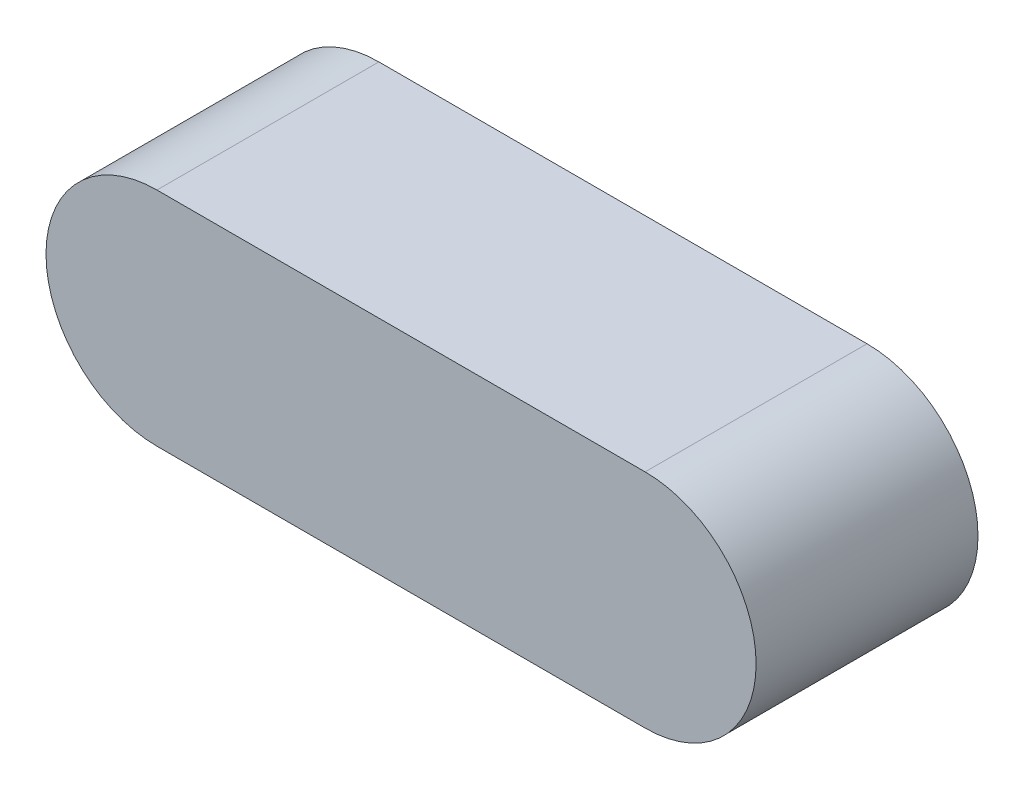
ISO-10303-21;
HEADER;
FILE_DESCRIPTION(('STEP AP214'),'2;1');
FILE_NAME('part.step','',(''),(''),'','','');
FILE_SCHEMA(('AUTOMOTIVE_DESIGN { 1 0 10303 214 1 1 1 1 }'));
ENDSEC;
DATA;
#1=APPLICATION_CONTEXT('core data for automotive mechanical design processes');
#2=APPLICATION_PROTOCOL_DEFINITION('international standard','automotive_design',2000,#1);
#3=PRODUCT_CONTEXT('',#1,'mechanical');
#4=PRODUCT('Part','Part','',(#3));
#5=PRODUCT_RELATED_PRODUCT_CATEGORY('part','',(#4));
#6=PRODUCT_DEFINITION_FORMATION('','',#4);
#7=PRODUCT_DEFINITION_CONTEXT('part definition',#1,'design');
#8=PRODUCT_DEFINITION('design','',#6,#7);
#9=PRODUCT_DEFINITION_SHAPE('','',#8);
#10=(LENGTH_UNIT() NAMED_UNIT(*) SI_UNIT(.MILLI.,.METRE.));
#11=(NAMED_UNIT(*) PLANE_ANGLE_UNIT() SI_UNIT($,.RADIAN.));
#12=(NAMED_UNIT(*) SI_UNIT($,.STERADIAN.) SOLID_ANGLE_UNIT());
#13=UNCERTAINTY_MEASURE_WITH_UNIT(LENGTH_MEASURE(1.E-05),#10,'distance_accuracy_value','');
#14=(GEOMETRIC_REPRESENTATION_CONTEXT(3) GLOBAL_UNCERTAINTY_ASSIGNED_CONTEXT((#13)) GLOBAL_UNIT_ASSIGNED_CONTEXT((#10,
#11,#12)) REPRESENTATION_CONTEXT('',''));
#15=CARTESIAN_POINT('',(0.,0.,0.));
#16=DIRECTION('',(0.,0.,1.));
#17=DIRECTION('',(1.,0.,0.));
#18=AXIS2_PLACEMENT_3D('',#15,#16,#17);
#19=CARTESIAN_POINT('',(0.,0.,5.));
#20=DIRECTION('',(0.,0.,-1.));
#21=DIRECTION('',(-1.,0.,0.));
#22=AXIS2_PLACEMENT_3D('',#19,#20,#21);
#23=CYLINDRICAL_SURFACE('',#22,2.5);
#24=CARTESIAN_POINT('',(0.,0.,0.));
#25=DIRECTION('',(0.,0.,1.));
#26=DIRECTION('',(1.,0.,0.));
#27=AXIS2_PLACEMENT_3D('',#24,#25,#26);
#28=CIRCLE('',#27,2.5);
#29=CARTESIAN_POINT('',(0.,2.5,0.));
#30=VERTEX_POINT('',#29);
#31=CARTESIAN_POINT('',(0.,-2.5,0.));
#32=VERTEX_POINT('',#31);
#33=EDGE_CURVE('E113',#30,#32,#28,.T.);
#34=ORIENTED_EDGE('',*,*,#33,.T.);
#35=DIRECTION('',(0.,0.,-1.));
#36=VECTOR('',#35,1.);
#37=CARTESIAN_POINT('',(0.,-2.5,5.));
#38=LINE('',#37,#36);
#39=CARTESIAN_POINT('',(0.,-2.5,5.));
#40=VERTEX_POINT('',#39);
#41=EDGE_CURVE('E11',#40,#32,#38,.T.);
#42=ORIENTED_EDGE('',*,*,#41,.F.);
#43=CARTESIAN_POINT('',(0.,0.,5.));
#44=DIRECTION('',(0.,0.,1.));
#45=DIRECTION('',(1.,0.,0.));
#46=AXIS2_PLACEMENT_3D('',#43,#44,#45);
#47=CIRCLE('',#46,2.5);
#48=CARTESIAN_POINT('',(0.,2.5,5.));
#49=VERTEX_POINT('',#48);
#50=EDGE_CURVE('E97',#49,#40,#47,.T.);
#51=ORIENTED_EDGE('',*,*,#50,.F.);
#52=DIRECTION('',(0.,0.,-1.));
#53=VECTOR('',#52,1.);
#54=CARTESIAN_POINT('',(0.,2.5,5.));
#55=LINE('',#54,#53);
#56=EDGE_CURVE('E109',#49,#30,#55,.T.);
#57=ORIENTED_EDGE('',*,*,#56,.T.);
#58=EDGE_LOOP('',(#34,#42,#51,#57));
#59=FACE_BOUND('',#58,.T.);
#60=ADVANCED_FACE('F45',(#59),#23,.T.);
#61=CARTESIAN_POINT('',(0.,-2.5,5.));
#62=DIRECTION('',(0.,1.,0.));
#63=DIRECTION('',(0.,0.,1.));
#64=AXIS2_PLACEMENT_3D('',#61,#62,#63);
#65=PLANE('',#64);
#66=DIRECTION('',(1.,0.,0.));
#67=VECTOR('',#66,1.);
#68=CARTESIAN_POINT('',(0.,-2.5,0.));
#69=LINE('',#68,#67);
#70=CARTESIAN_POINT('',(11.,-2.5,0.));
#71=VERTEX_POINT('',#70);
#72=EDGE_CURVE('E102',#32,#71,#69,.T.);
#73=ORIENTED_EDGE('',*,*,#72,.T.);
#74=DIRECTION('',(0.,0.,-1.));
#75=VECTOR('',#74,1.);
#76=CARTESIAN_POINT('',(11.,-2.5,5.));
#77=LINE('',#76,#75);
#78=CARTESIAN_POINT('',(11.,-2.5,5.));
#79=VERTEX_POINT('',#78);
#80=EDGE_CURVE('E54',#79,#71,#77,.T.);
#81=ORIENTED_EDGE('',*,*,#80,.F.);
#82=DIRECTION('',(1.,0.,0.));
#83=VECTOR('',#82,1.);
#84=CARTESIAN_POINT('',(0.,-2.5,5.));
#85=LINE('',#84,#83);
#86=EDGE_CURVE('E92',#40,#79,#85,.T.);
#87=ORIENTED_EDGE('',*,*,#86,.F.);
#88=ORIENTED_EDGE('',*,*,#41,.T.);
#89=EDGE_LOOP('',(#73,#81,#87,#88));
#90=FACE_BOUND('',#89,.T.);
#91=ADVANCED_FACE('F101',(#90),#65,.F.);
#92=CARTESIAN_POINT('',(11.,0.,5.));
#93=DIRECTION('',(0.,0.,-1.));
#94=DIRECTION('',(-1.,0.,0.));
#95=AXIS2_PLACEMENT_3D('',#92,#93,#94);
#96=CYLINDRICAL_SURFACE('',#95,2.5);
#97=CARTESIAN_POINT('',(11.,0.,0.));
#98=DIRECTION('',(0.,0.,1.));
#99=DIRECTION('',(1.,0.,0.));
#100=AXIS2_PLACEMENT_3D('',#97,#98,#99);
#101=CIRCLE('',#100,2.5);
#102=CARTESIAN_POINT('',(11.,2.5,0.));
#103=VERTEX_POINT('',#102);
#104=EDGE_CURVE('E79',#71,#103,#101,.T.);
#105=ORIENTED_EDGE('',*,*,#104,.T.);
#106=DIRECTION('',(0.,0.,-1.));
#107=VECTOR('',#106,1.);
#108=CARTESIAN_POINT('',(11.,2.5,5.));
#109=LINE('',#108,#107);
#110=CARTESIAN_POINT('',(11.,2.5,5.));
#111=VERTEX_POINT('',#110);
#112=EDGE_CURVE('E104',#111,#103,#109,.T.);
#113=ORIENTED_EDGE('',*,*,#112,.F.);
#114=CARTESIAN_POINT('',(11.,0.,5.));
#115=DIRECTION('',(0.,0.,1.));
#116=DIRECTION('',(1.,0.,0.));
#117=AXIS2_PLACEMENT_3D('',#114,#115,#116);
#118=CIRCLE('',#117,2.5);
#119=EDGE_CURVE('E95',#79,#111,#118,.T.);
#120=ORIENTED_EDGE('',*,*,#119,.F.);
#121=ORIENTED_EDGE('',*,*,#80,.T.);
#122=EDGE_LOOP('',(#105,#113,#120,#121));
#123=FACE_BOUND('',#122,.T.);
#124=ADVANCED_FACE('F105',(#123),#96,.T.);
#125=CARTESIAN_POINT('',(0.,2.5,5.));
#126=DIRECTION('',(0.,-1.,0.));
#127=DIRECTION('',(0.,0.,-1.));
#128=AXIS2_PLACEMENT_3D('',#125,#126,#127);
#129=PLANE('',#128);
#130=DIRECTION('',(-1.,0.,0.));
#131=VECTOR('',#130,1.);
#132=CARTESIAN_POINT('',(0.,2.5,0.));
#133=LINE('',#132,#131);
#134=EDGE_CURVE('E85',#103,#30,#133,.T.);
#135=ORIENTED_EDGE('',*,*,#134,.T.);
#136=ORIENTED_EDGE('',*,*,#56,.F.);
#137=DIRECTION('',(-1.,0.,0.));
#138=VECTOR('',#137,1.);
#139=CARTESIAN_POINT('',(0.,2.5,5.));
#140=LINE('',#139,#138);
#141=EDGE_CURVE('E62',#111,#49,#140,.T.);
#142=ORIENTED_EDGE('',*,*,#141,.F.);
#143=ORIENTED_EDGE('',*,*,#112,.T.);
#144=EDGE_LOOP('',(#135,#136,#142,#143));
#145=FACE_BOUND('',#144,.T.);
#146=ADVANCED_FACE('F126',(#145),#129,.F.);
#147=CARTESIAN_POINT('',(0.,0.,5.));
#148=DIRECTION('',(0.,0.,1.));
#149=DIRECTION('',(1.,0.,0.));
#150=AXIS2_PLACEMENT_3D('',#147,#148,#149);
#151=PLANE('',#150);
#152=ORIENTED_EDGE('',*,*,#50,.T.);
#153=ORIENTED_EDGE('',*,*,#86,.T.);
#154=ORIENTED_EDGE('',*,*,#119,.T.);
#155=ORIENTED_EDGE('',*,*,#141,.T.);
#156=EDGE_LOOP('',(#152,#153,#154,#155));
#157=FACE_BOUND('',#156,.T.);
#158=ADVANCED_FACE('F93',(#157),#151,.T.);
#159=CARTESIAN_POINT('',(0.,0.,0.));
#160=DIRECTION('',(0.,0.,1.));
#161=DIRECTION('',(1.,0.,0.));
#162=AXIS2_PLACEMENT_3D('',#159,#160,#161);
#163=PLANE('',#162);
#164=ORIENTED_EDGE('',*,*,#33,.F.);
#165=ORIENTED_EDGE('',*,*,#134,.F.);
#166=ORIENTED_EDGE('',*,*,#104,.F.);
#167=ORIENTED_EDGE('',*,*,#72,.F.);
#168=EDGE_LOOP('',(#164,#165,#166,#167));
#169=FACE_BOUND('',#168,.T.);
#170=ADVANCED_FACE('F129',(#169),#163,.F.);
#171=CLOSED_SHELL('',(#60,#91,#124,#146,#158,#170));
#172=MANIFOLD_SOLID_BREP('B2',#171);
#173=ADVANCED_BREP_SHAPE_REPRESENTATION('',(#18,#172),#14);
#174=SHAPE_DEFINITION_REPRESENTATION(#9,#173);
ENDSEC;
END-ISO-10303-21;
